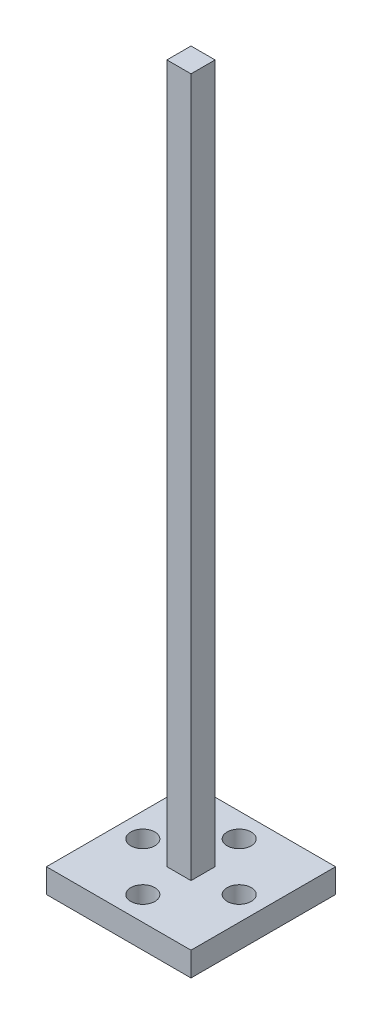
ISO-10303-21;
HEADER;
FILE_DESCRIPTION(('STEP AP214'),'2;1');
FILE_NAME('part.step','',(''),(''),'','','');
FILE_SCHEMA(('AUTOMOTIVE_DESIGN { 1 0 10303 214 1 1 1 1 }'));
ENDSEC;
DATA;
#1=APPLICATION_CONTEXT('core data for automotive mechanical design processes');
#2=APPLICATION_PROTOCOL_DEFINITION('international standard','automotive_design',2000,#1);
#3=PRODUCT_CONTEXT('',#1,'mechanical');
#4=PRODUCT('Part','Part','',(#3));
#5=PRODUCT_RELATED_PRODUCT_CATEGORY('part','',(#4));
#6=PRODUCT_DEFINITION_FORMATION('','',#4);
#7=PRODUCT_DEFINITION_CONTEXT('part definition',#1,'design');
#8=PRODUCT_DEFINITION('design','',#6,#7);
#9=PRODUCT_DEFINITION_SHAPE('','',#8);
#10=(LENGTH_UNIT() NAMED_UNIT(*) SI_UNIT(.MILLI.,.METRE.));
#11=(NAMED_UNIT(*) PLANE_ANGLE_UNIT() SI_UNIT($,.RADIAN.));
#12=(NAMED_UNIT(*) SI_UNIT($,.STERADIAN.) SOLID_ANGLE_UNIT());
#13=UNCERTAINTY_MEASURE_WITH_UNIT(LENGTH_MEASURE(1.E-05),#10,'distance_accuracy_value','');
#14=(GEOMETRIC_REPRESENTATION_CONTEXT(3) GLOBAL_UNCERTAINTY_ASSIGNED_CONTEXT((#13)) GLOBAL_UNIT_ASSIGNED_CONTEXT((#10,
#11,#12)) REPRESENTATION_CONTEXT('',''));
#15=CARTESIAN_POINT('',(0.,0.,0.));
#16=DIRECTION('',(0.,0.,1.));
#17=DIRECTION('',(1.,0.,0.));
#18=AXIS2_PLACEMENT_3D('',#15,#16,#17);
#19=CARTESIAN_POINT('',(0.,5.,0.));
#20=DIRECTION('',(0.,1.,0.));
#21=DIRECTION('',(0.,0.,1.));
#22=AXIS2_PLACEMENT_3D('',#19,#20,#21);
#23=PLANE('',#22);
#24=CARTESIAN_POINT('',(0.,5.,-10.));
#25=DIRECTION('',(0.,1.,0.));
#26=DIRECTION('',(0.,0.,1.));
#27=AXIS2_PLACEMENT_3D('',#24,#25,#26);
#28=CIRCLE('',#27,2.5);
#29=CARTESIAN_POINT('',(0.,5.,-7.5));
#30=VERTEX_POINT('',#29);
#31=EDGE_CURVE('E337',#30,#30,#28,.T.);
#32=ORIENTED_EDGE('',*,*,#31,.F.);
#33=EDGE_LOOP('',(#32));
#34=FACE_BOUND('',#33,.T.);
#35=CARTESIAN_POINT('',(10.,5.,0.));
#36=DIRECTION('',(0.,1.,0.));
#37=DIRECTION('',(0.,0.,1.));
#38=AXIS2_PLACEMENT_3D('',#35,#36,#37);
#39=CIRCLE('',#38,2.5);
#40=CARTESIAN_POINT('',(10.,5.,2.5));
#41=VERTEX_POINT('',#40);
#42=EDGE_CURVE('E346',#41,#41,#39,.T.);
#43=ORIENTED_EDGE('',*,*,#42,.F.);
#44=EDGE_LOOP('',(#43));
#45=FACE_BOUND('',#44,.T.);
#46=CARTESIAN_POINT('',(0.,5.,10.));
#47=DIRECTION('',(0.,1.,0.));
#48=DIRECTION('',(0.,0.,1.));
#49=AXIS2_PLACEMENT_3D('',#46,#47,#48);
#50=CIRCLE('',#49,2.5);
#51=CARTESIAN_POINT('',(0.,5.,12.5));
#52=VERTEX_POINT('',#51);
#53=EDGE_CURVE('E354',#52,#52,#50,.T.);
#54=ORIENTED_EDGE('',*,*,#53,.F.);
#55=EDGE_LOOP('',(#54));
#56=FACE_BOUND('',#55,.T.);
#57=CARTESIAN_POINT('',(-10.,5.,0.));
#58=DIRECTION('',(0.,1.,0.));
#59=DIRECTION('',(0.,0.,1.));
#60=AXIS2_PLACEMENT_3D('',#57,#58,#59);
#61=CIRCLE('',#60,2.5);
#62=CARTESIAN_POINT('',(-10.,5.,2.5));
#63=VERTEX_POINT('',#62);
#64=EDGE_CURVE('E362',#63,#63,#61,.T.);
#65=ORIENTED_EDGE('',*,*,#64,.F.);
#66=EDGE_LOOP('',(#65));
#67=FACE_BOUND('',#66,.T.);
#68=DIRECTION('',(0.,0.,1.));
#69=VECTOR('',#68,1.);
#70=CARTESIAN_POINT('',(-15.,5.,-15.));
#71=LINE('',#70,#69);
#72=CARTESIAN_POINT('',(-15.,5.,-15.));
#73=VERTEX_POINT('',#72);
#74=CARTESIAN_POINT('',(-15.,5.,15.));
#75=VERTEX_POINT('',#74);
#76=EDGE_CURVE('E147',#73,#75,#71,.T.);
#77=ORIENTED_EDGE('',*,*,#76,.T.);
#78=DIRECTION('',(1.,0.,0.));
#79=VECTOR('',#78,1.);
#80=CARTESIAN_POINT('',(-15.,5.,15.));
#81=LINE('',#80,#79);
#82=CARTESIAN_POINT('',(15.,5.,15.));
#83=VERTEX_POINT('',#82);
#84=EDGE_CURVE('E151',#75,#83,#81,.T.);
#85=ORIENTED_EDGE('',*,*,#84,.T.);
#86=DIRECTION('',(0.,0.,1.));
#87=VECTOR('',#86,1.);
#88=CARTESIAN_POINT('',(15.,5.,-15.));
#89=LINE('',#88,#87);
#90=CARTESIAN_POINT('',(15.,5.,-15.));
#91=VERTEX_POINT('',#90);
#92=EDGE_CURVE('E155',#91,#83,#89,.T.);
#93=ORIENTED_EDGE('',*,*,#92,.F.);
#94=DIRECTION('',(1.,0.,0.));
#95=VECTOR('',#94,1.);
#96=CARTESIAN_POINT('',(-15.,5.,-15.));
#97=LINE('',#96,#95);
#98=EDGE_CURVE('E159',#73,#91,#97,.T.);
#99=ORIENTED_EDGE('',*,*,#98,.F.);
#100=EDGE_LOOP('',(#77,#85,#93,#99));
#101=FACE_BOUND('',#100,.T.);
#102=DIRECTION('',(-1.,0.,0.));
#103=VECTOR('',#102,1.);
#104=CARTESIAN_POINT('',(0.,5.,2.49999999999999));
#105=LINE('',#104,#103);
#106=CARTESIAN_POINT('',(2.5,5.,2.49999999999999));
#107=VERTEX_POINT('',#106);
#108=CARTESIAN_POINT('',(-2.5,5.,2.49999999999999));
#109=VERTEX_POINT('',#108);
#110=EDGE_CURVE('E55',#107,#109,#105,.T.);
#111=ORIENTED_EDGE('',*,*,#110,.T.);
#112=DIRECTION('',(0.,0.,-1.));
#113=VECTOR('',#112,1.);
#114=CARTESIAN_POINT('',(-2.5,5.,0.));
#115=LINE('',#114,#113);
#116=CARTESIAN_POINT('',(-2.5,5.,-2.50000000000001));
#117=VERTEX_POINT('',#116);
#118=EDGE_CURVE('E128',#109,#117,#115,.T.);
#119=ORIENTED_EDGE('',*,*,#118,.T.);
#120=DIRECTION('',(-1.,0.,0.));
#121=VECTOR('',#120,1.);
#122=CARTESIAN_POINT('',(0.,5.,-2.50000000000001));
#123=LINE('',#122,#121);
#124=CARTESIAN_POINT('',(2.5,5.,-2.50000000000001));
#125=VERTEX_POINT('',#124);
#126=EDGE_CURVE('E130',#125,#117,#123,.T.);
#127=ORIENTED_EDGE('',*,*,#126,.F.);
#128=DIRECTION('',(0.,0.,-1.));
#129=VECTOR('',#128,1.);
#130=CARTESIAN_POINT('',(2.5,5.,0.));
#131=LINE('',#130,#129);
#132=EDGE_CURVE('E60',#107,#125,#131,.T.);
#133=ORIENTED_EDGE('',*,*,#132,.F.);
#134=EDGE_LOOP('',(#111,#119,#127,#133));
#135=FACE_BOUND('',#134,.T.);
#136=ADVANCED_FACE('F39',(#34,#45,#56,#67,#101,#135),#23,.T.);
#137=CARTESIAN_POINT('',(-15.,5.,-15.));
#138=DIRECTION('',(1.,0.,0.));
#139=DIRECTION('',(0.,0.,-1.));
#140=AXIS2_PLACEMENT_3D('',#137,#138,#139);
#141=PLANE('',#140);
#142=DIRECTION('',(0.,0.,1.));
#143=VECTOR('',#142,1.);
#144=CARTESIAN_POINT('',(-15.,0.,-15.));
#145=LINE('',#144,#143);
#146=CARTESIAN_POINT('',(-15.,0.,-15.));
#147=VERTEX_POINT('',#146);
#148=CARTESIAN_POINT('',(-15.,0.,15.));
#149=VERTEX_POINT('',#148);
#150=EDGE_CURVE('E146',#147,#149,#145,.T.);
#151=ORIENTED_EDGE('',*,*,#150,.T.);
#152=DIRECTION('',(0.,-1.,0.));
#153=VECTOR('',#152,1.);
#154=CARTESIAN_POINT('',(-15.,5.,15.));
#155=LINE('',#154,#153);
#156=EDGE_CURVE('E11',#75,#149,#155,.T.);
#157=ORIENTED_EDGE('',*,*,#156,.F.);
#158=ORIENTED_EDGE('',*,*,#76,.F.);
#159=DIRECTION('',(0.,-1.,0.));
#160=VECTOR('',#159,1.);
#161=CARTESIAN_POINT('',(-15.,5.,-15.));
#162=LINE('',#161,#160);
#163=EDGE_CURVE('E163',#73,#147,#162,.T.);
#164=ORIENTED_EDGE('',*,*,#163,.T.);
#165=EDGE_LOOP('',(#151,#157,#158,#164));
#166=FACE_BOUND('',#165,.T.);
#167=ADVANCED_FACE('F41',(#166),#141,.F.);
#168=CARTESIAN_POINT('',(-15.,5.,15.));
#169=DIRECTION('',(0.,0.,-1.));
#170=DIRECTION('',(-1.,0.,0.));
#171=AXIS2_PLACEMENT_3D('',#168,#169,#170);
#172=PLANE('',#171);
#173=DIRECTION('',(1.,0.,0.));
#174=VECTOR('',#173,1.);
#175=CARTESIAN_POINT('',(-15.,0.,15.));
#176=LINE('',#175,#174);
#177=CARTESIAN_POINT('',(15.,0.,15.));
#178=VERTEX_POINT('',#177);
#179=EDGE_CURVE('E167',#149,#178,#176,.T.);
#180=ORIENTED_EDGE('',*,*,#179,.T.);
#181=DIRECTION('',(0.,-1.,0.));
#182=VECTOR('',#181,1.);
#183=CARTESIAN_POINT('',(15.,5.,15.));
#184=LINE('',#183,#182);
#185=EDGE_CURVE('E48',#83,#178,#184,.T.);
#186=ORIENTED_EDGE('',*,*,#185,.F.);
#187=ORIENTED_EDGE('',*,*,#84,.F.);
#188=ORIENTED_EDGE('',*,*,#156,.T.);
#189=EDGE_LOOP('',(#180,#186,#187,#188));
#190=FACE_BOUND('',#189,.T.);
#191=ADVANCED_FACE('F189',(#190),#172,.F.);
#192=CARTESIAN_POINT('',(15.,5.,-15.));
#193=DIRECTION('',(1.,0.,0.));
#194=DIRECTION('',(0.,0.,-1.));
#195=AXIS2_PLACEMENT_3D('',#192,#193,#194);
#196=PLANE('',#195);
#197=DIRECTION('',(0.,0.,1.));
#198=VECTOR('',#197,1.);
#199=CARTESIAN_POINT('',(15.,0.,-15.));
#200=LINE('',#199,#198);
#201=CARTESIAN_POINT('',(15.,0.,-15.));
#202=VERTEX_POINT('',#201);
#203=EDGE_CURVE('E171',#202,#178,#200,.T.);
#204=ORIENTED_EDGE('',*,*,#203,.F.);
#205=DIRECTION('',(0.,-1.,0.));
#206=VECTOR('',#205,1.);
#207=CARTESIAN_POINT('',(15.,5.,-15.));
#208=LINE('',#207,#206);
#209=EDGE_CURVE('E180',#91,#202,#208,.T.);
#210=ORIENTED_EDGE('',*,*,#209,.F.);
#211=ORIENTED_EDGE('',*,*,#92,.T.);
#212=ORIENTED_EDGE('',*,*,#185,.T.);
#213=EDGE_LOOP('',(#204,#210,#211,#212));
#214=FACE_BOUND('',#213,.T.);
#215=ADVANCED_FACE('F186',(#214),#196,.T.);
#216=CARTESIAN_POINT('',(-15.,5.,-15.));
#217=DIRECTION('',(0.,0.,-1.));
#218=DIRECTION('',(-1.,0.,0.));
#219=AXIS2_PLACEMENT_3D('',#216,#217,#218);
#220=PLANE('',#219);
#221=DIRECTION('',(1.,0.,0.));
#222=VECTOR('',#221,1.);
#223=CARTESIAN_POINT('',(-15.,0.,-15.));
#224=LINE('',#223,#222);
#225=EDGE_CURVE('E152',#147,#202,#224,.T.);
#226=ORIENTED_EDGE('',*,*,#225,.F.);
#227=ORIENTED_EDGE('',*,*,#163,.F.);
#228=ORIENTED_EDGE('',*,*,#98,.T.);
#229=ORIENTED_EDGE('',*,*,#209,.T.);
#230=EDGE_LOOP('',(#226,#227,#228,#229));
#231=FACE_BOUND('',#230,.T.);
#232=ADVANCED_FACE('F196',(#231),#220,.T.);
#233=CARTESIAN_POINT('',(0.,0.,0.));
#234=DIRECTION('',(0.,1.,0.));
#235=DIRECTION('',(0.,0.,1.));
#236=AXIS2_PLACEMENT_3D('',#233,#234,#235);
#237=PLANE('',#236);
#238=CARTESIAN_POINT('',(0.,0.,-10.));
#239=DIRECTION('',(0.,1.,0.));
#240=DIRECTION('',(0.,0.,1.));
#241=AXIS2_PLACEMENT_3D('',#238,#239,#240);
#242=CIRCLE('',#241,2.5);
#243=CARTESIAN_POINT('',(0.,0.,-7.5));
#244=VERTEX_POINT('',#243);
#245=EDGE_CURVE('E125',#244,#244,#242,.F.);
#246=ORIENTED_EDGE('',*,*,#245,.F.);
#247=EDGE_LOOP('',(#246));
#248=FACE_BOUND('',#247,.T.);
#249=CARTESIAN_POINT('',(10.,0.,0.));
#250=DIRECTION('',(0.,1.,0.));
#251=DIRECTION('',(0.,0.,1.));
#252=AXIS2_PLACEMENT_3D('',#249,#250,#251);
#253=CIRCLE('',#252,2.5);
#254=CARTESIAN_POINT('',(10.,0.,2.5));
#255=VERTEX_POINT('',#254);
#256=EDGE_CURVE('E343',#255,#255,#253,.F.);
#257=ORIENTED_EDGE('',*,*,#256,.F.);
#258=EDGE_LOOP('',(#257));
#259=FACE_BOUND('',#258,.T.);
#260=CARTESIAN_POINT('',(0.,0.,10.));
#261=DIRECTION('',(0.,1.,0.));
#262=DIRECTION('',(0.,0.,1.));
#263=AXIS2_PLACEMENT_3D('',#260,#261,#262);
#264=CIRCLE('',#263,2.5);
#265=CARTESIAN_POINT('',(0.,0.,12.5));
#266=VERTEX_POINT('',#265);
#267=EDGE_CURVE('E350',#266,#266,#264,.F.);
#268=ORIENTED_EDGE('',*,*,#267,.F.);
#269=EDGE_LOOP('',(#268));
#270=FACE_BOUND('',#269,.T.);
#271=CARTESIAN_POINT('',(-10.,0.,0.));
#272=DIRECTION('',(0.,1.,0.));
#273=DIRECTION('',(0.,0.,1.));
#274=AXIS2_PLACEMENT_3D('',#271,#272,#273);
#275=CIRCLE('',#274,2.5);
#276=CARTESIAN_POINT('',(-10.,0.,2.5));
#277=VERTEX_POINT('',#276);
#278=EDGE_CURVE('E358',#277,#277,#275,.F.);
#279=ORIENTED_EDGE('',*,*,#278,.F.);
#280=EDGE_LOOP('',(#279));
#281=FACE_BOUND('',#280,.T.);
#282=ORIENTED_EDGE('',*,*,#150,.F.);
#283=ORIENTED_EDGE('',*,*,#225,.T.);
#284=ORIENTED_EDGE('',*,*,#203,.T.);
#285=ORIENTED_EDGE('',*,*,#179,.F.);
#286=EDGE_LOOP('',(#282,#283,#284,#285));
#287=FACE_BOUND('',#286,.T.);
#288=ADVANCED_FACE('F193',(#248,#259,#270,#281,#287),#237,.F.);
#289=CARTESIAN_POINT('',(-2.5,150.,-2.50000000000001));
#290=DIRECTION('',(1.,0.,0.));
#291=DIRECTION('',(0.,0.,-1.));
#292=AXIS2_PLACEMENT_3D('',#289,#290,#291);
#293=PLANE('',#292);
#294=ORIENTED_EDGE('',*,*,#118,.F.);
#295=DIRECTION('',(0.,-1.,0.));
#296=VECTOR('',#295,1.);
#297=CARTESIAN_POINT('',(-2.5,150.,2.49999999999999));
#298=LINE('',#297,#296);
#299=CARTESIAN_POINT('',(-2.5,150.,2.49999999999999));
#300=VERTEX_POINT('',#299);
#301=EDGE_CURVE('E107',#300,#109,#298,.T.);
#302=ORIENTED_EDGE('',*,*,#301,.F.);
#303=DIRECTION('',(0.,0.,1.));
#304=VECTOR('',#303,1.);
#305=CARTESIAN_POINT('',(-2.5,150.,-2.50000000000001));
#306=LINE('',#305,#304);
#307=CARTESIAN_POINT('',(-2.5,150.,-2.50000000000001));
#308=VERTEX_POINT('',#307);
#309=EDGE_CURVE('E115',#308,#300,#306,.T.);
#310=ORIENTED_EDGE('',*,*,#309,.F.);
#311=DIRECTION('',(0.,-1.,0.));
#312=VECTOR('',#311,1.);
#313=CARTESIAN_POINT('',(-2.5,150.,-2.50000000000001));
#314=LINE('',#313,#312);
#315=EDGE_CURVE('E373',#308,#117,#314,.T.);
#316=ORIENTED_EDGE('',*,*,#315,.T.);
#317=EDGE_LOOP('',(#294,#302,#310,#316));
#318=FACE_BOUND('',#317,.T.);
#319=ADVANCED_FACE('F127',(#318),#293,.F.);
#320=CARTESIAN_POINT('',(-2.5,150.,2.49999999999999));
#321=DIRECTION('',(0.,0.,-1.));
#322=DIRECTION('',(-1.,0.,0.));
#323=AXIS2_PLACEMENT_3D('',#320,#321,#322);
#324=PLANE('',#323);
#325=ORIENTED_EDGE('',*,*,#110,.F.);
#326=DIRECTION('',(0.,-1.,0.));
#327=VECTOR('',#326,1.);
#328=CARTESIAN_POINT('',(2.5,150.,2.49999999999999));
#329=LINE('',#328,#327);
#330=CARTESIAN_POINT('',(2.5,150.,2.49999999999999));
#331=VERTEX_POINT('',#330);
#332=EDGE_CURVE('E109',#331,#107,#329,.T.);
#333=ORIENTED_EDGE('',*,*,#332,.F.);
#334=DIRECTION('',(1.,0.,0.));
#335=VECTOR('',#334,1.);
#336=CARTESIAN_POINT('',(-2.5,150.,2.49999999999999));
#337=LINE('',#336,#335);
#338=EDGE_CURVE('E103',#300,#331,#337,.T.);
#339=ORIENTED_EDGE('',*,*,#338,.F.);
#340=ORIENTED_EDGE('',*,*,#301,.T.);
#341=EDGE_LOOP('',(#325,#333,#339,#340));
#342=FACE_BOUND('',#341,.T.);
#343=ADVANCED_FACE('F105',(#342),#324,.F.);
#344=CARTESIAN_POINT('',(2.5,150.,-2.50000000000001));
#345=DIRECTION('',(1.,0.,0.));
#346=DIRECTION('',(0.,0.,-1.));
#347=AXIS2_PLACEMENT_3D('',#344,#345,#346);
#348=PLANE('',#347);
#349=ORIENTED_EDGE('',*,*,#332,.T.);
#350=ORIENTED_EDGE('',*,*,#132,.T.);
#351=DIRECTION('',(0.,-1.,0.));
#352=VECTOR('',#351,1.);
#353=CARTESIAN_POINT('',(2.5,150.,-2.50000000000001));
#354=LINE('',#353,#352);
#355=CARTESIAN_POINT('',(2.5,150.,-2.50000000000001));
#356=VERTEX_POINT('',#355);
#357=EDGE_CURVE('E136',#356,#125,#354,.T.);
#358=ORIENTED_EDGE('',*,*,#357,.F.);
#359=DIRECTION('',(0.,0.,1.));
#360=VECTOR('',#359,1.);
#361=CARTESIAN_POINT('',(2.5,150.,-2.50000000000001));
#362=LINE('',#361,#360);
#363=EDGE_CURVE('E114',#356,#331,#362,.T.);
#364=ORIENTED_EDGE('',*,*,#363,.T.);
#365=EDGE_LOOP('',(#349,#350,#358,#364));
#366=FACE_BOUND('',#365,.T.);
#367=ADVANCED_FACE('F245',(#366),#348,.T.);
#368=CARTESIAN_POINT('',(-2.5,150.,-2.50000000000001));
#369=DIRECTION('',(0.,0.,-1.));
#370=DIRECTION('',(-1.,0.,0.));
#371=AXIS2_PLACEMENT_3D('',#368,#369,#370);
#372=PLANE('',#371);
#373=ORIENTED_EDGE('',*,*,#357,.T.);
#374=ORIENTED_EDGE('',*,*,#126,.T.);
#375=ORIENTED_EDGE('',*,*,#315,.F.);
#376=DIRECTION('',(1.,0.,0.));
#377=VECTOR('',#376,1.);
#378=CARTESIAN_POINT('',(-2.5,150.,-2.50000000000001));
#379=LINE('',#378,#377);
#380=EDGE_CURVE('E121',#308,#356,#379,.T.);
#381=ORIENTED_EDGE('',*,*,#380,.T.);
#382=EDGE_LOOP('',(#373,#374,#375,#381));
#383=FACE_BOUND('',#382,.T.);
#384=ADVANCED_FACE('F251',(#383),#372,.T.);
#385=CARTESIAN_POINT('',(0.,150.,0.));
#386=DIRECTION('',(0.,1.,0.));
#387=DIRECTION('',(0.,0.,1.));
#388=AXIS2_PLACEMENT_3D('',#385,#386,#387);
#389=PLANE('',#388);
#390=ORIENTED_EDGE('',*,*,#309,.T.);
#391=ORIENTED_EDGE('',*,*,#338,.T.);
#392=ORIENTED_EDGE('',*,*,#363,.F.);
#393=ORIENTED_EDGE('',*,*,#380,.F.);
#394=EDGE_LOOP('',(#390,#391,#392,#393));
#395=FACE_BOUND('',#394,.T.);
#396=ADVANCED_FACE('F119',(#395),#389,.T.);
#397=CARTESIAN_POINT('',(-10.,-0.00100000000000013,0.));
#398=DIRECTION('',(0.,1.,0.));
#399=DIRECTION('',(0.,0.,1.));
#400=AXIS2_PLACEMENT_3D('',#397,#398,#399);
#401=CYLINDRICAL_SURFACE('',#400,2.5);
#402=ORIENTED_EDGE('',*,*,#64,.T.);
#403=EDGE_LOOP('',(#402));
#404=FACE_BOUND('',#403,.T.);
#405=ORIENTED_EDGE('',*,*,#278,.T.);
#406=EDGE_LOOP('',(#405));
#407=FACE_BOUND('',#406,.T.);
#408=ADVANCED_FACE('F266',(#404,#407),#401,.F.);
#409=CARTESIAN_POINT('',(0.,-0.00100000000000013,10.));
#410=DIRECTION('',(0.,1.,0.));
#411=DIRECTION('',(0.,0.,1.));
#412=AXIS2_PLACEMENT_3D('',#409,#410,#411);
#413=CYLINDRICAL_SURFACE('',#412,2.5);
#414=ORIENTED_EDGE('',*,*,#53,.T.);
#415=EDGE_LOOP('',(#414));
#416=FACE_BOUND('',#415,.T.);
#417=ORIENTED_EDGE('',*,*,#267,.T.);
#418=EDGE_LOOP('',(#417));
#419=FACE_BOUND('',#418,.T.);
#420=ADVANCED_FACE('F272',(#416,#419),#413,.F.);
#421=CARTESIAN_POINT('',(10.,-0.00100000000000013,0.));
#422=DIRECTION('',(0.,1.,0.));
#423=DIRECTION('',(0.,0.,1.));
#424=AXIS2_PLACEMENT_3D('',#421,#422,#423);
#425=CYLINDRICAL_SURFACE('',#424,2.5);
#426=ORIENTED_EDGE('',*,*,#42,.T.);
#427=EDGE_LOOP('',(#426));
#428=FACE_BOUND('',#427,.T.);
#429=ORIENTED_EDGE('',*,*,#256,.T.);
#430=EDGE_LOOP('',(#429));
#431=FACE_BOUND('',#430,.T.);
#432=ADVANCED_FACE('F280',(#428,#431),#425,.F.);
#433=CARTESIAN_POINT('',(0.,-0.00100000000000013,-10.));
#434=DIRECTION('',(0.,1.,0.));
#435=DIRECTION('',(0.,0.,1.));
#436=AXIS2_PLACEMENT_3D('',#433,#434,#435);
#437=CYLINDRICAL_SURFACE('',#436,2.5);
#438=ORIENTED_EDGE('',*,*,#31,.T.);
#439=EDGE_LOOP('',(#438));
#440=FACE_BOUND('',#439,.T.);
#441=ORIENTED_EDGE('',*,*,#245,.T.);
#442=EDGE_LOOP('',(#441));
#443=FACE_BOUND('',#442,.T.);
#444=ADVANCED_FACE('F288',(#440,#443),#437,.F.);
#445=CLOSED_SHELL('',(#136,#167,#191,#215,#232,#288,#319,#343,#367,#384,#396,#408,#420,#432,#444));
#446=MANIFOLD_SOLID_BREP('B2',#445);
#447=ADVANCED_BREP_SHAPE_REPRESENTATION('',(#18,#446),#14);
#448=SHAPE_DEFINITION_REPRESENTATION(#9,#447);
ENDSEC;
END-ISO-10303-21;
